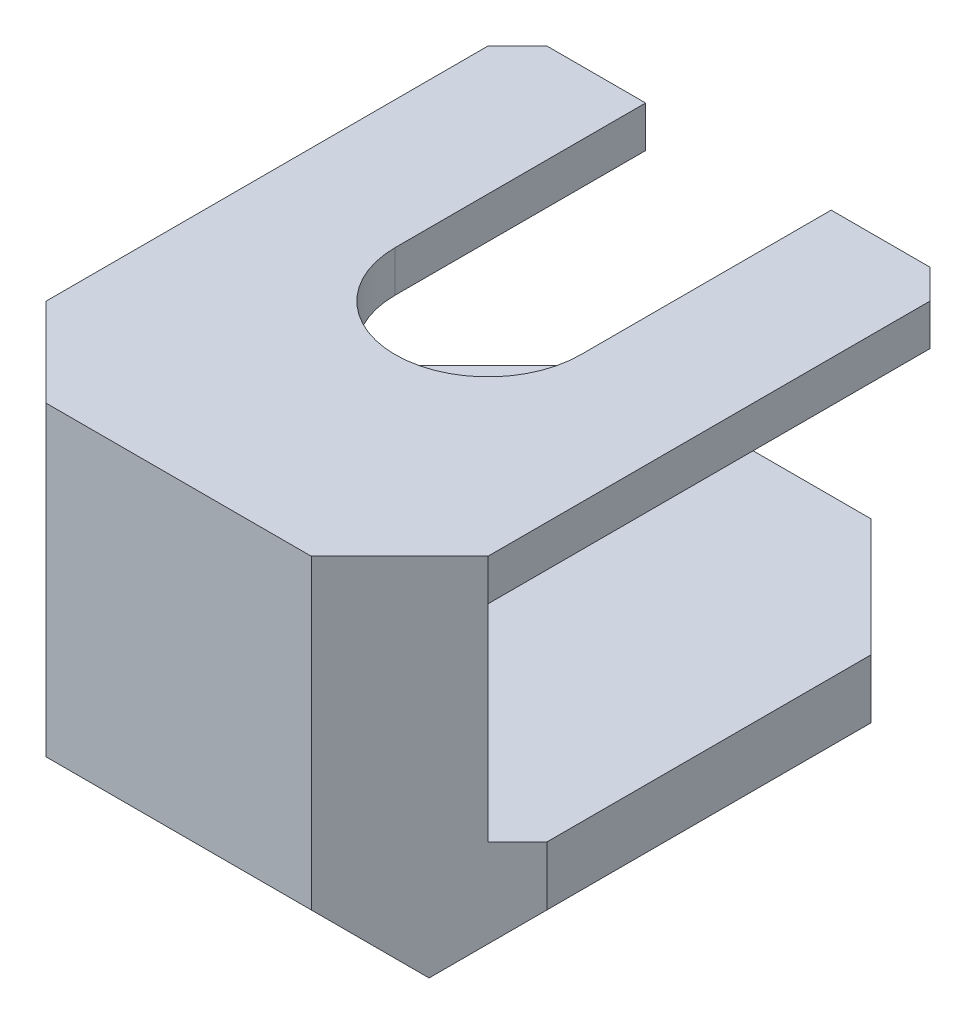
ISO-10303-21;
HEADER;
FILE_DESCRIPTION(('STEP AP214'),'2;1');
FILE_NAME('part.step','',(''),(''),'','','');
FILE_SCHEMA(('AUTOMOTIVE_DESIGN { 1 0 10303 214 1 1 1 1 }'));
ENDSEC;
DATA;
#1=APPLICATION_CONTEXT('core data for automotive mechanical design processes');
#2=APPLICATION_PROTOCOL_DEFINITION('international standard','automotive_design',2000,#1);
#3=PRODUCT_CONTEXT('',#1,'mechanical');
#4=PRODUCT('Part','Part','',(#3));
#5=PRODUCT_RELATED_PRODUCT_CATEGORY('part','',(#4));
#6=PRODUCT_DEFINITION_FORMATION('','',#4);
#7=PRODUCT_DEFINITION_CONTEXT('part definition',#1,'design');
#8=PRODUCT_DEFINITION('design','',#6,#7);
#9=PRODUCT_DEFINITION_SHAPE('','',#8);
#10=(LENGTH_UNIT() NAMED_UNIT(*) SI_UNIT(.MILLI.,.METRE.));
#11=(NAMED_UNIT(*) PLANE_ANGLE_UNIT() SI_UNIT($,.RADIAN.));
#12=(NAMED_UNIT(*) SI_UNIT($,.STERADIAN.) SOLID_ANGLE_UNIT());
#13=UNCERTAINTY_MEASURE_WITH_UNIT(LENGTH_MEASURE(1.E-05),#10,'distance_accuracy_value','');
#14=(GEOMETRIC_REPRESENTATION_CONTEXT(3) GLOBAL_UNCERTAINTY_ASSIGNED_CONTEXT((#13)) GLOBAL_UNIT_ASSIGNED_CONTEXT((#10,
#11,#12)) REPRESENTATION_CONTEXT('',''));
#15=CARTESIAN_POINT('',(0.,0.,0.));
#16=DIRECTION('',(0.,0.,1.));
#17=DIRECTION('',(1.,0.,0.));
#18=AXIS2_PLACEMENT_3D('',#15,#16,#17);
#19=CARTESIAN_POINT('',(-3.15,1.4,0.));
#20=DIRECTION('',(-1.,0.,0.));
#21=DIRECTION('',(0.,0.,1.));
#22=AXIS2_PLACEMENT_3D('',#19,#20,#21);
#23=PLANE('',#22);
#24=DIRECTION('',(0.,0.,-1.));
#25=VECTOR('',#24,1.);
#26=CARTESIAN_POINT('',(-3.15,0.,0.));
#27=LINE('',#26,#25);
#28=CARTESIAN_POINT('',(-3.15,0.,0.));
#29=VERTEX_POINT('',#28);
#30=CARTESIAN_POINT('',(-3.15,0.,-8.5));
#31=VERTEX_POINT('',#30);
#32=EDGE_CURVE('E285',#29,#31,#27,.T.);
#33=ORIENTED_EDGE('',*,*,#32,.T.);
#34=DIRECTION('',(0.,-1.,0.));
#35=VECTOR('',#34,1.);
#36=CARTESIAN_POINT('',(-3.15,1.4,-8.5));
#37=LINE('',#36,#35);
#38=CARTESIAN_POINT('',(-3.15,1.4,-8.5));
#39=VERTEX_POINT('',#38);
#40=EDGE_CURVE('E298',#39,#31,#37,.T.);
#41=ORIENTED_EDGE('',*,*,#40,.F.);
#42=DIRECTION('',(0.,0.,-1.));
#43=VECTOR('',#42,1.);
#44=CARTESIAN_POINT('',(-3.15,1.4,0.));
#45=LINE('',#44,#43);
#46=CARTESIAN_POINT('',(-3.15,1.4,0.));
#47=VERTEX_POINT('',#46);
#48=EDGE_CURVE('E272',#47,#39,#45,.T.);
#49=ORIENTED_EDGE('',*,*,#48,.F.);
#50=DIRECTION('',(0.,-1.,0.));
#51=VECTOR('',#50,1.);
#52=CARTESIAN_POINT('',(-3.15,1.4,0.));
#53=LINE('',#52,#51);
#54=EDGE_CURVE('E301',#47,#29,#53,.T.);
#55=ORIENTED_EDGE('',*,*,#54,.T.);
#56=EDGE_LOOP('',(#33,#41,#49,#55));
#57=FACE_BOUND('',#56,.T.);
#58=ADVANCED_FACE('F39',(#57),#23,.F.);
#59=CARTESIAN_POINT('',(0.,1.4,0.));
#60=DIRECTION('',(0.,-1.,0.));
#61=DIRECTION('',(0.,0.,-1.));
#62=AXIS2_PLACEMENT_3D('',#59,#60,#61);
#63=CYLINDRICAL_SURFACE('',#62,3.15);
#64=CARTESIAN_POINT('',(0.,0.,0.));
#65=DIRECTION('',(0.,-1.,0.));
#66=DIRECTION('',(0.,0.,1.));
#67=AXIS2_PLACEMENT_3D('',#64,#65,#66);
#68=CIRCLE('',#67,3.15);
#69=CARTESIAN_POINT('',(3.15,0.,0.));
#70=VERTEX_POINT('',#69);
#71=EDGE_CURVE('E267',#70,#29,#68,.T.);
#72=ORIENTED_EDGE('',*,*,#71,.T.);
#73=ORIENTED_EDGE('',*,*,#54,.F.);
#74=CARTESIAN_POINT('',(0.,1.4,0.));
#75=DIRECTION('',(0.,-1.,0.));
#76=DIRECTION('',(0.,0.,1.));
#77=AXIS2_PLACEMENT_3D('',#74,#75,#76);
#78=CIRCLE('',#77,3.15);
#79=CARTESIAN_POINT('',(3.15,1.4,0.));
#80=VERTEX_POINT('',#79);
#81=EDGE_CURVE('E269',#80,#47,#78,.T.);
#82=ORIENTED_EDGE('',*,*,#81,.F.);
#83=DIRECTION('',(0.,-1.,0.));
#84=VECTOR('',#83,1.);
#85=CARTESIAN_POINT('',(3.15,1.4,0.));
#86=LINE('',#85,#84);
#87=EDGE_CURVE('E282',#80,#70,#86,.T.);
#88=ORIENTED_EDGE('',*,*,#87,.T.);
#89=EDGE_LOOP('',(#72,#73,#82,#88));
#90=FACE_BOUND('',#89,.T.);
#91=ADVANCED_FACE('F376',(#90),#63,.F.);
#92=CARTESIAN_POINT('',(3.15,1.4,-8.5));
#93=DIRECTION('',(1.,0.,0.));
#94=DIRECTION('',(0.,0.,-1.));
#95=AXIS2_PLACEMENT_3D('',#92,#93,#94);
#96=PLANE('',#95);
#97=DIRECTION('',(0.,0.,1.));
#98=VECTOR('',#97,1.);
#99=CARTESIAN_POINT('',(3.15,0.,-8.5));
#100=LINE('',#99,#98);
#101=CARTESIAN_POINT('',(3.15,0.,-8.5));
#102=VERTEX_POINT('',#101);
#103=EDGE_CURVE('E273',#102,#70,#100,.T.);
#104=ORIENTED_EDGE('',*,*,#103,.T.);
#105=ORIENTED_EDGE('',*,*,#87,.F.);
#106=DIRECTION('',(0.,0.,1.));
#107=VECTOR('',#106,1.);
#108=CARTESIAN_POINT('',(3.15,1.4,-8.5));
#109=LINE('',#108,#107);
#110=CARTESIAN_POINT('',(3.15,1.4,-8.5));
#111=VERTEX_POINT('',#110);
#112=EDGE_CURVE('E280',#111,#80,#109,.T.);
#113=ORIENTED_EDGE('',*,*,#112,.F.);
#114=DIRECTION('',(0.,-1.,0.));
#115=VECTOR('',#114,1.);
#116=CARTESIAN_POINT('',(3.15,1.4,-8.5));
#117=LINE('',#116,#115);
#118=EDGE_CURVE('E295',#111,#102,#117,.T.);
#119=ORIENTED_EDGE('',*,*,#118,.T.);
#120=EDGE_LOOP('',(#104,#105,#113,#119));
#121=FACE_BOUND('',#120,.T.);
#122=ADVANCED_FACE('F380',(#121),#96,.F.);
#123=CARTESIAN_POINT('',(8.5,1.4,-8.5));
#124=DIRECTION('',(0.,0.,1.));
#125=DIRECTION('',(1.,0.,0.));
#126=AXIS2_PLACEMENT_3D('',#123,#124,#125);
#127=PLANE('',#126);
#128=DIRECTION('',(-1.,0.,0.));
#129=VECTOR('',#128,1.);
#130=CARTESIAN_POINT('',(8.5,1.4,-8.5));
#131=LINE('',#130,#129);
#132=CARTESIAN_POINT('',(6.49999999999998,1.4,-8.5));
#133=VERTEX_POINT('',#132);
#134=EDGE_CURVE('E278',#133,#111,#131,.T.);
#135=ORIENTED_EDGE('',*,*,#134,.F.);
#136=DIRECTION('',(0.,-1.,0.));
#137=VECTOR('',#136,1.);
#138=CARTESIAN_POINT('',(6.49999999999998,1.4,-8.5));
#139=LINE('',#138,#137);
#140=CARTESIAN_POINT('',(6.49999999999998,0.,-8.5));
#141=VERTEX_POINT('',#140);
#142=EDGE_CURVE('E44',#133,#141,#139,.T.);
#143=ORIENTED_EDGE('',*,*,#142,.T.);
#144=DIRECTION('',(-1.,0.,0.));
#145=VECTOR('',#144,1.);
#146=CARTESIAN_POINT('',(8.5,0.,-8.5));
#147=LINE('',#146,#145);
#148=EDGE_CURVE('E290',#141,#102,#147,.T.);
#149=ORIENTED_EDGE('',*,*,#148,.T.);
#150=ORIENTED_EDGE('',*,*,#118,.F.);
#151=EDGE_LOOP('',(#135,#143,#149,#150));
#152=FACE_BOUND('',#151,.T.);
#153=ADVANCED_FACE('F336',(#152),#127,.F.);
#154=CARTESIAN_POINT('',(-6.49999999999999,1.4,-8.5));
#155=DIRECTION('',(0.70710678118655,0.,0.707106781186545));
#156=DIRECTION('',(0.,1.,0.));
#157=AXIS2_PLACEMENT_3D('',#154,#155,#156);
#158=PLANE('',#157);
#159=DIRECTION('',(-0.707106781186545,0.,0.70710678118655));
#160=VECTOR('',#159,1.);
#161=CARTESIAN_POINT('',(-6.49999999999999,0.,-8.5));
#162=LINE('',#161,#160);
#163=CARTESIAN_POINT('',(-7.49999999999999,0.,-7.49999999999999));
#164=VERTEX_POINT('',#163);
#165=CARTESIAN_POINT('',(-6.49999999999999,0.,-8.5));
#166=VERTEX_POINT('',#165);
#167=EDGE_CURVE('E327',#164,#166,#162,.F.);
#168=ORIENTED_EDGE('',*,*,#167,.F.);
#169=DIRECTION('',(0.,-1.,0.));
#170=VECTOR('',#169,1.);
#171=CARTESIAN_POINT('',(-7.49999999999999,-21.001,-7.49999999999999));
#172=LINE('',#171,#170);
#173=CARTESIAN_POINT('',(-7.49999999999999,1.4,-7.49999999999999));
#174=VERTEX_POINT('',#173);
#175=EDGE_CURVE('E324',#174,#164,#172,.T.);
#176=ORIENTED_EDGE('',*,*,#175,.F.);
#177=DIRECTION('',(0.707106781186545,0.,-0.70710678118655));
#178=VECTOR('',#177,1.);
#179=CARTESIAN_POINT('',(-7.50000000000002,1.4,-7.49999999999996));
#180=LINE('',#179,#178);
#181=CARTESIAN_POINT('',(-6.49999999999999,1.4,-8.5));
#182=VERTEX_POINT('',#181);
#183=EDGE_CURVE('E322',#182,#174,#180,.F.);
#184=ORIENTED_EDGE('',*,*,#183,.F.);
#185=DIRECTION('',(0.,1.,0.));
#186=VECTOR('',#185,1.);
#187=CARTESIAN_POINT('',(-6.49999999999999,1.4,-8.5));
#188=LINE('',#187,#186);
#189=EDGE_CURVE('E317',#166,#182,#188,.T.);
#190=ORIENTED_EDGE('',*,*,#189,.F.);
#191=EDGE_LOOP('',(#168,#176,#184,#190));
#192=FACE_BOUND('',#191,.T.);
#193=ADVANCED_FACE('F366',(#192),#158,.F.);
#194=DIRECTION('',(-1.,0.,0.));
#195=VECTOR('',#194,1.);
#196=CARTESIAN_POINT('',(-3.15,0.,-8.5));
#197=LINE('',#196,#195);
#198=EDGE_CURVE('E287',#31,#166,#197,.T.);
#199=ORIENTED_EDGE('',*,*,#198,.T.);
#200=ORIENTED_EDGE('',*,*,#189,.T.);
#201=DIRECTION('',(-1.,0.,0.));
#202=VECTOR('',#201,1.);
#203=CARTESIAN_POINT('',(-3.15,1.4,-8.5));
#204=LINE('',#203,#202);
#205=EDGE_CURVE('E275',#39,#182,#204,.T.);
#206=ORIENTED_EDGE('',*,*,#205,.F.);
#207=ORIENTED_EDGE('',*,*,#40,.T.);
#208=EDGE_LOOP('',(#199,#200,#206,#207));
#209=FACE_BOUND('',#208,.T.);
#210=ADVANCED_FACE('F369',(#209),#127,.F.);
#211=CARTESIAN_POINT('',(7.49999999999999,-21.001,-7.5));
#212=DIRECTION('',(-0.707106781186545,0.,0.70710678118655));
#213=DIRECTION('',(0.,1.,0.));
#214=AXIS2_PLACEMENT_3D('',#211,#212,#213);
#215=PLANE('',#214);
#216=DIRECTION('',(-0.70710678118655,0.,-0.707106781186545));
#217=VECTOR('',#216,1.);
#218=CARTESIAN_POINT('',(7.49999999999999,0.,-7.5));
#219=LINE('',#218,#217);
#220=CARTESIAN_POINT('',(7.49999999999999,0.,-7.5));
#221=VERTEX_POINT('',#220);
#222=EDGE_CURVE('E62',#141,#221,#219,.F.);
#223=ORIENTED_EDGE('',*,*,#222,.F.);
#224=ORIENTED_EDGE('',*,*,#142,.F.);
#225=DIRECTION('',(0.70710678118655,0.,0.707106781186545));
#226=VECTOR('',#225,1.);
#227=CARTESIAN_POINT('',(7.49999999999997,1.4,-7.50000000000002));
#228=LINE('',#227,#226);
#229=CARTESIAN_POINT('',(7.49999999999999,1.4,-7.5));
#230=VERTEX_POINT('',#229);
#231=EDGE_CURVE('E320',#230,#133,#228,.F.);
#232=ORIENTED_EDGE('',*,*,#231,.F.);
#233=DIRECTION('',(0.,1.,0.));
#234=VECTOR('',#233,1.);
#235=CARTESIAN_POINT('',(7.49999999999999,-21.001,-7.5));
#236=LINE('',#235,#234);
#237=EDGE_CURVE('E328',#221,#230,#236,.T.);
#238=ORIENTED_EDGE('',*,*,#237,.F.);
#239=EDGE_LOOP('',(#223,#224,#232,#238));
#240=FACE_BOUND('',#239,.T.);
#241=ADVANCED_FACE('F42',(#240),#215,.F.);
#242=CARTESIAN_POINT('',(0.,0.,0.));
#243=DIRECTION('',(0.,1.,0.));
#244=DIRECTION('',(0.,0.,1.));
#245=AXIS2_PLACEMENT_3D('',#242,#243,#244);
#246=PLANE('',#245);
#247=DIRECTION('',(0.,0.,1.));
#248=VECTOR('',#247,1.);
#249=CARTESIAN_POINT('',(-7.49999999999999,0.,7.5));
#250=LINE('',#249,#248);
#251=CARTESIAN_POINT('',(-7.49999999999999,0.,7.5));
#252=VERTEX_POINT('',#251);
#253=EDGE_CURVE('E255',#164,#252,#250,.T.);
#254=ORIENTED_EDGE('',*,*,#253,.F.);
#255=ORIENTED_EDGE('',*,*,#167,.T.);
#256=ORIENTED_EDGE('',*,*,#198,.F.);
#257=ORIENTED_EDGE('',*,*,#32,.F.);
#258=ORIENTED_EDGE('',*,*,#71,.F.);
#259=ORIENTED_EDGE('',*,*,#103,.F.);
#260=ORIENTED_EDGE('',*,*,#148,.F.);
#261=ORIENTED_EDGE('',*,*,#222,.T.);
#262=DIRECTION('',(0.,0.,-1.));
#263=VECTOR('',#262,1.);
#264=CARTESIAN_POINT('',(7.49999999999999,0.,7.5));
#265=LINE('',#264,#263);
#266=CARTESIAN_POINT('',(7.49999999999999,0.,7.5));
#267=VERTEX_POINT('',#266);
#268=EDGE_CURVE('E249',#267,#221,#265,.T.);
#269=ORIENTED_EDGE('',*,*,#268,.F.);
#270=DIRECTION('',(-1.,0.,0.));
#271=VECTOR('',#270,1.);
#272=CARTESIAN_POINT('',(8.5,0.,7.5));
#273=LINE('',#272,#271);
#274=EDGE_CURVE('E265',#267,#252,#273,.T.);
#275=ORIENTED_EDGE('',*,*,#274,.T.);
#276=EDGE_LOOP('',(#254,#255,#256,#257,#258,#259,#260,#261,#269,#275));
#277=FACE_BOUND('',#276,.T.);
#278=ADVANCED_FACE('F341',(#277),#246,.F.);
#279=CARTESIAN_POINT('',(-7.49999999999999,-21.001,7.5));
#280=DIRECTION('',(1.,0.,0.));
#281=DIRECTION('',(0.,0.,-1.));
#282=AXIS2_PLACEMENT_3D('',#279,#280,#281);
#283=PLANE('',#282);
#284=DIRECTION('',(0.,0.,-1.));
#285=VECTOR('',#284,1.);
#286=CARTESIAN_POINT('',(-7.49999999999999,1.4,7.5));
#287=LINE('',#286,#285);
#288=CARTESIAN_POINT('',(-7.49999999999999,1.4,7.5));
#289=VERTEX_POINT('',#288);
#290=EDGE_CURVE('E257',#289,#174,#287,.T.);
#291=ORIENTED_EDGE('',*,*,#290,.T.);
#292=ORIENTED_EDGE('',*,*,#175,.T.);
#293=ORIENTED_EDGE('',*,*,#253,.T.);
#294=DIRECTION('',(0.,1.,0.));
#295=VECTOR('',#294,1.);
#296=CARTESIAN_POINT('',(-7.49999999999999,-21.001,7.5));
#297=LINE('',#296,#295);
#298=EDGE_CURVE('E260',#252,#289,#297,.T.);
#299=ORIENTED_EDGE('',*,*,#298,.T.);
#300=EDGE_LOOP('',(#291,#292,#293,#299));
#301=FACE_BOUND('',#300,.T.);
#302=ADVANCED_FACE('F464',(#301),#283,.F.);
#303=CARTESIAN_POINT('',(0.,0.,10.5));
#304=DIRECTION('',(0.,0.,1.));
#305=DIRECTION('',(1.,0.,0.));
#306=AXIS2_PLACEMENT_3D('',#303,#304,#305);
#307=PLANE('',#306);
#308=DIRECTION('',(0.,-1.,0.));
#309=VECTOR('',#308,1.);
#310=CARTESIAN_POINT('',(-4.5,-17.,10.5));
#311=LINE('',#310,#309);
#312=CARTESIAN_POINT('',(-4.5,1.4,10.5));
#313=VERTEX_POINT('',#312);
#314=CARTESIAN_POINT('',(-4.5,-8.99999999999998,10.5));
#315=VERTEX_POINT('',#314);
#316=EDGE_CURVE('E306',#313,#315,#311,.T.);
#317=ORIENTED_EDGE('',*,*,#316,.T.);
#318=DIRECTION('',(1.,0.,0.));
#319=VECTOR('',#318,1.);
#320=CARTESIAN_POINT('',(0.,-8.99999999999998,10.5));
#321=LINE('',#320,#319);
#322=CARTESIAN_POINT('',(4.5,-8.99999999999998,10.5));
#323=VERTEX_POINT('',#322);
#324=EDGE_CURVE('E739',#315,#323,#321,.T.);
#325=ORIENTED_EDGE('',*,*,#324,.T.);
#326=DIRECTION('',(0.,1.,0.));
#327=VECTOR('',#326,1.);
#328=CARTESIAN_POINT('',(4.5,1.4,10.5));
#329=LINE('',#328,#327);
#330=CARTESIAN_POINT('',(4.5,1.4,10.5));
#331=VERTEX_POINT('',#330);
#332=EDGE_CURVE('E304',#323,#331,#329,.T.);
#333=ORIENTED_EDGE('',*,*,#332,.T.);
#334=DIRECTION('',(-1.,0.,0.));
#335=VECTOR('',#334,1.);
#336=CARTESIAN_POINT('',(8.5,1.4,10.5));
#337=LINE('',#336,#335);
#338=EDGE_CURVE('E252',#331,#313,#337,.T.);
#339=ORIENTED_EDGE('',*,*,#338,.T.);
#340=EDGE_LOOP('',(#317,#325,#333,#339));
#341=FACE_BOUND('',#340,.T.);
#342=ADVANCED_FACE('F467',(#341),#307,.T.);
#343=CARTESIAN_POINT('',(0.,1.4,0.));
#344=DIRECTION('',(0.,1.,0.));
#345=DIRECTION('',(0.,0.,1.));
#346=AXIS2_PLACEMENT_3D('',#343,#344,#345);
#347=PLANE('',#346);
#348=ORIENTED_EDGE('',*,*,#205,.T.);
#349=ORIENTED_EDGE('',*,*,#183,.T.);
#350=ORIENTED_EDGE('',*,*,#290,.F.);
#351=DIRECTION('',(0.707106781186546,0.,0.707106781186549));
#352=VECTOR('',#351,1.);
#353=CARTESIAN_POINT('',(-7.50000000000001,1.4,7.49999999999998));
#354=LINE('',#353,#352);
#355=EDGE_CURVE('E315',#289,#313,#354,.T.);
#356=ORIENTED_EDGE('',*,*,#355,.T.);
#357=ORIENTED_EDGE('',*,*,#338,.F.);
#358=DIRECTION('',(0.707106781186546,0.,-0.707106781186549));
#359=VECTOR('',#358,1.);
#360=CARTESIAN_POINT('',(7.50000000000001,1.4,7.49999999999998));
#361=LINE('',#360,#359);
#362=CARTESIAN_POINT('',(7.49999999999999,1.4,7.5));
#363=VERTEX_POINT('',#362);
#364=EDGE_CURVE('E312',#331,#363,#361,.T.);
#365=ORIENTED_EDGE('',*,*,#364,.T.);
#366=DIRECTION('',(0.,0.,1.));
#367=VECTOR('',#366,1.);
#368=CARTESIAN_POINT('',(7.49999999999999,1.4,7.5));
#369=LINE('',#368,#367);
#370=EDGE_CURVE('E247',#230,#363,#369,.T.);
#371=ORIENTED_EDGE('',*,*,#370,.F.);
#372=ORIENTED_EDGE('',*,*,#231,.T.);
#373=ORIENTED_EDGE('',*,*,#134,.T.);
#374=ORIENTED_EDGE('',*,*,#112,.T.);
#375=ORIENTED_EDGE('',*,*,#81,.T.);
#376=ORIENTED_EDGE('',*,*,#48,.T.);
#377=EDGE_LOOP('',(#348,#349,#350,#356,#357,#365,#371,#372,#373,#374,#375,#376));
#378=FACE_BOUND('',#377,.T.);
#379=ADVANCED_FACE('F344',(#378),#347,.T.);
#380=CARTESIAN_POINT('',(7.49999999999999,-21.001,7.5));
#381=DIRECTION('',(-1.,0.,0.));
#382=DIRECTION('',(0.,0.,1.));
#383=AXIS2_PLACEMENT_3D('',#380,#381,#382);
#384=PLANE('',#383);
#385=ORIENTED_EDGE('',*,*,#268,.T.);
#386=ORIENTED_EDGE('',*,*,#237,.T.);
#387=ORIENTED_EDGE('',*,*,#370,.T.);
#388=DIRECTION('',(0.,1.,0.));
#389=VECTOR('',#388,1.);
#390=CARTESIAN_POINT('',(7.49999999999999,-21.001,7.5));
#391=LINE('',#390,#389);
#392=EDGE_CURVE('E250',#267,#363,#391,.T.);
#393=ORIENTED_EDGE('',*,*,#392,.F.);
#394=EDGE_LOOP('',(#385,#386,#387,#393));
#395=FACE_BOUND('',#394,.T.);
#396=ADVANCED_FACE('F347',(#395),#384,.F.);
#397=CARTESIAN_POINT('',(0.,0.,7.5));
#398=DIRECTION('',(0.,0.,-1.));
#399=DIRECTION('',(-1.,0.,0.));
#400=AXIS2_PLACEMENT_3D('',#397,#398,#399);
#401=PLANE('',#400);
#402=DIRECTION('',(1.,0.,0.));
#403=VECTOR('',#402,1.);
#404=CARTESIAN_POINT('',(8.5,-7.,7.5));
#405=LINE('',#404,#403);
#406=CARTESIAN_POINT('',(-7.49999999999999,-7.,7.5));
#407=VERTEX_POINT('',#406);
#408=CARTESIAN_POINT('',(7.49999999999999,-7.,7.5));
#409=VERTEX_POINT('',#408);
#410=EDGE_CURVE('E12',#407,#409,#405,.T.);
#411=ORIENTED_EDGE('',*,*,#410,.F.);
#412=DIRECTION('',(0.,1.,0.));
#413=VECTOR('',#412,1.);
#414=CARTESIAN_POINT('',(-7.49999999999999,0.,7.5));
#415=LINE('',#414,#413);
#416=EDGE_CURVE('E310',#407,#252,#415,.T.);
#417=ORIENTED_EDGE('',*,*,#416,.T.);
#418=ORIENTED_EDGE('',*,*,#274,.F.);
#419=DIRECTION('',(0.,-1.,0.));
#420=VECTOR('',#419,1.);
#421=CARTESIAN_POINT('',(7.49999999999999,0.,7.5));
#422=LINE('',#421,#420);
#423=EDGE_CURVE('E308',#267,#409,#422,.T.);
#424=ORIENTED_EDGE('',*,*,#423,.T.);
#425=EDGE_LOOP('',(#411,#417,#418,#424));
#426=FACE_BOUND('',#425,.T.);
#427=ADVANCED_FACE('F353',(#426),#401,.T.);
#428=CARTESIAN_POINT('',(4.5,0.,10.5));
#429=DIRECTION('',(0.707106781186549,0.,0.707106781186546));
#430=DIRECTION('',(0.,-1.,0.));
#431=AXIS2_PLACEMENT_3D('',#428,#429,#430);
#432=PLANE('',#431);
#433=ORIENTED_EDGE('',*,*,#332,.F.);
#434=DIRECTION('',(0.577350269189624,-0.577350269189628,-0.577350269189626));
#435=VECTOR('',#434,1.);
#436=CARTESIAN_POINT('',(3.00000000000001,-7.49999999999998,12.));
#437=LINE('',#436,#435);
#438=CARTESIAN_POINT('',(6.5,-11.,8.5));
#439=VERTEX_POINT('',#438);
#440=EDGE_CURVE('E239',#439,#323,#437,.F.);
#441=ORIENTED_EDGE('',*,*,#440,.F.);
#442=DIRECTION('',(-0.577350269189624,-0.577350269189626,0.577350269189626));
#443=VECTOR('',#442,1.);
#444=CARTESIAN_POINT('',(7.99999999999999,-9.49999999999999,6.99999999999999));
#445=LINE('',#444,#443);
#446=CARTESIAN_POINT('',(8.5,-8.99999999999998,6.49999999999998));
#447=VERTEX_POINT('',#446);
#448=EDGE_CURVE('E210',#447,#439,#445,.T.);
#449=ORIENTED_EDGE('',*,*,#448,.F.);
#450=DIRECTION('',(0.,-1.,0.));
#451=VECTOR('',#450,1.);
#452=CARTESIAN_POINT('',(8.5,-8.99999999999998,6.49999999999998));
#453=LINE('',#452,#451);
#454=CARTESIAN_POINT('',(8.5,-7.,6.49999999999998));
#455=VERTEX_POINT('',#454);
#456=EDGE_CURVE('E233',#455,#447,#453,.T.);
#457=ORIENTED_EDGE('',*,*,#456,.F.);
#458=DIRECTION('',(-0.707106781186546,0.,0.707106781186549));
#459=VECTOR('',#458,1.);
#460=CARTESIAN_POINT('',(4.5,-7.,10.5));
#461=LINE('',#460,#459);
#462=EDGE_CURVE('E243',#455,#409,#461,.T.);
#463=ORIENTED_EDGE('',*,*,#462,.T.);
#464=ORIENTED_EDGE('',*,*,#423,.F.);
#465=ORIENTED_EDGE('',*,*,#392,.T.);
#466=ORIENTED_EDGE('',*,*,#364,.F.);
#467=EDGE_LOOP('',(#433,#441,#449,#457,#463,#464,#465,#466));
#468=FACE_BOUND('',#467,.T.);
#469=ADVANCED_FACE('F350',(#468),#432,.T.);
#470=CARTESIAN_POINT('',(-4.5,0.,10.5));
#471=DIRECTION('',(-0.707106781186549,0.,0.707106781186546));
#472=DIRECTION('',(0.,1.,0.));
#473=AXIS2_PLACEMENT_3D('',#470,#471,#472);
#474=PLANE('',#473);
#475=ORIENTED_EDGE('',*,*,#416,.F.);
#476=DIRECTION('',(-0.707106781186546,0.,-0.707106781186549));
#477=VECTOR('',#476,1.);
#478=CARTESIAN_POINT('',(-4.5,-7.,10.5));
#479=LINE('',#478,#477);
#480=CARTESIAN_POINT('',(-8.5,-7.,6.49999999999999));
#481=VERTEX_POINT('',#480);
#482=EDGE_CURVE('E219',#407,#481,#479,.T.);
#483=ORIENTED_EDGE('',*,*,#482,.T.);
#484=DIRECTION('',(0.,1.,0.));
#485=VECTOR('',#484,1.);
#486=CARTESIAN_POINT('',(-8.5,9.4,6.49999999999999));
#487=LINE('',#486,#485);
#488=CARTESIAN_POINT('',(-8.5,-8.99999999999998,6.49999999999999));
#489=VERTEX_POINT('',#488);
#490=EDGE_CURVE('E218',#489,#481,#487,.T.);
#491=ORIENTED_EDGE('',*,*,#490,.F.);
#492=DIRECTION('',(-0.577350269189625,0.577350269189626,-0.577350269189627));
#493=VECTOR('',#492,1.);
#494=CARTESIAN_POINT('',(-7.99999999999999,-9.49999999999999,6.99999999999999));
#495=LINE('',#494,#493);
#496=CARTESIAN_POINT('',(-6.5,-11.,8.5));
#497=VERTEX_POINT('',#496);
#498=EDGE_CURVE('E226',#497,#489,#495,.T.);
#499=ORIENTED_EDGE('',*,*,#498,.F.);
#500=DIRECTION('',(0.577350269189624,0.577350269189628,0.577350269189626));
#501=VECTOR('',#500,1.);
#502=CARTESIAN_POINT('',(-3.00000000000001,-7.49999999999998,12.));
#503=LINE('',#502,#501);
#504=EDGE_CURVE('E246',#315,#497,#503,.F.);
#505=ORIENTED_EDGE('',*,*,#504,.F.);
#506=ORIENTED_EDGE('',*,*,#316,.F.);
#507=ORIENTED_EDGE('',*,*,#355,.F.);
#508=ORIENTED_EDGE('',*,*,#298,.F.);
#509=EDGE_LOOP('',(#475,#483,#491,#499,#505,#506,#507,#508));
#510=FACE_BOUND('',#509,.T.);
#511=ADVANCED_FACE('F356',(#510),#474,.T.);
#512=CARTESIAN_POINT('',(-4.49999999999998,-7.,-8.5));
#513=DIRECTION('',(0.,1.,0.));
#514=DIRECTION('',(0.,0.,1.));
#515=AXIS2_PLACEMENT_3D('',#512,#513,#514);
#516=PLANE('',#515);
#517=ORIENTED_EDGE('',*,*,#482,.F.);
#518=ORIENTED_EDGE('',*,*,#410,.T.);
#519=ORIENTED_EDGE('',*,*,#462,.F.);
#520=DIRECTION('',(0.,0.,-1.));
#521=VECTOR('',#520,1.);
#522=CARTESIAN_POINT('',(8.5,-7.,8.5));
#523=LINE('',#522,#521);
#524=CARTESIAN_POINT('',(8.5,-7.,-4.49999999999997));
#525=VERTEX_POINT('',#524);
#526=EDGE_CURVE('E220',#455,#525,#523,.T.);
#527=ORIENTED_EDGE('',*,*,#526,.T.);
#528=DIRECTION('',(0.707106781186551,0.,0.707106781186544));
#529=VECTOR('',#528,1.);
#530=CARTESIAN_POINT('',(4.49999999999993,-7.,-8.5));
#531=LINE('',#530,#529);
#532=CARTESIAN_POINT('',(4.49999999999993,-7.,-8.5));
#533=VERTEX_POINT('',#532);
#534=EDGE_CURVE('E209',#525,#533,#531,.F.);
#535=ORIENTED_EDGE('',*,*,#534,.T.);
#536=DIRECTION('',(1.,0.,0.));
#537=VECTOR('',#536,1.);
#538=CARTESIAN_POINT('',(-8.5,-7.,-8.5));
#539=LINE('',#538,#537);
#540=CARTESIAN_POINT('',(-4.49999999999998,-7.,-8.5));
#541=VERTEX_POINT('',#540);
#542=EDGE_CURVE('E205',#541,#533,#539,.T.);
#543=ORIENTED_EDGE('',*,*,#542,.F.);
#544=DIRECTION('',(0.707106781186544,0.,-0.707106781186551));
#545=VECTOR('',#544,1.);
#546=CARTESIAN_POINT('',(-8.5,-7.,-4.49999999999993));
#547=LINE('',#546,#545);
#548=CARTESIAN_POINT('',(-8.5,-7.,-4.49999999999993));
#549=VERTEX_POINT('',#548);
#550=EDGE_CURVE('E198',#541,#549,#547,.F.);
#551=ORIENTED_EDGE('',*,*,#550,.T.);
#552=DIRECTION('',(0.,0.,1.));
#553=VECTOR('',#552,1.);
#554=CARTESIAN_POINT('',(-8.5,-7.,-8.5));
#555=LINE('',#554,#553);
#556=EDGE_CURVE('E202',#549,#481,#555,.T.);
#557=ORIENTED_EDGE('',*,*,#556,.T.);
#558=EDGE_LOOP('',(#517,#518,#519,#527,#535,#543,#551,#557));
#559=FACE_BOUND('',#558,.T.);
#560=ADVANCED_FACE('F201',(#559),#516,.T.);
#561=CARTESIAN_POINT('',(0.,-8.5,0.));
#562=DIRECTION('',(0.,-1.,0.));
#563=DIRECTION('',(0.,0.,-1.));
#564=AXIS2_PLACEMENT_3D('',#561,#562,#563);
#565=PLANE('',#564);
#566=CARTESIAN_POINT('',(0.,-8.5,0.));
#567=DIRECTION('',(0.,-1.,0.));
#568=DIRECTION('',(0.,0.,-1.));
#569=AXIS2_PLACEMENT_3D('',#566,#567,#568);
#570=CIRCLE('',#569,2.45);
#571=CARTESIAN_POINT('',(0.,-8.5,-2.45));
#572=VERTEX_POINT('',#571);
#573=EDGE_CURVE('E746',#572,#572,#570,.T.);
#574=ORIENTED_EDGE('',*,*,#573,.T.);
#575=EDGE_LOOP('',(#574));
#576=FACE_BOUND('',#575,.T.);
#577=ADVANCED_FACE('F397',(#576),#565,.T.);
#578=CARTESIAN_POINT('',(0.,-8.5,0.));
#579=DIRECTION('',(0.,-1.,0.));
#580=DIRECTION('',(0.,0.,-1.));
#581=AXIS2_PLACEMENT_3D('',#578,#579,#580);
#582=CYLINDRICAL_SURFACE('',#581,2.45);
#583=ORIENTED_EDGE('',*,*,#573,.F.);
#584=EDGE_LOOP('',(#583));
#585=FACE_BOUND('',#584,.T.);
#586=CARTESIAN_POINT('',(0.,-13.,0.));
#587=DIRECTION('',(0.,-1.,0.));
#588=DIRECTION('',(0.,0.,-1.));
#589=AXIS2_PLACEMENT_3D('',#586,#587,#588);
#590=CIRCLE('',#589,2.45);
#591=CARTESIAN_POINT('',(0.,-13.,-2.45));
#592=VERTEX_POINT('',#591);
#593=EDGE_CURVE('E752',#592,#592,#590,.T.);
#594=ORIENTED_EDGE('',*,*,#593,.T.);
#595=EDGE_LOOP('',(#594));
#596=FACE_BOUND('',#595,.T.);
#597=ADVANCED_FACE('F423',(#585,#596),#582,.F.);
#598=CARTESIAN_POINT('',(0.,-13.,0.));
#599=DIRECTION('',(0.,-1.,0.));
#600=DIRECTION('',(0.,0.,-1.));
#601=AXIS2_PLACEMENT_3D('',#598,#599,#600);
#602=PLANE('',#601);
#603=DIRECTION('',(0.,0.,1.));
#604=VECTOR('',#603,1.);
#605=CARTESIAN_POINT('',(4.5,-13.,10.5));
#606=LINE('',#605,#604);
#607=CARTESIAN_POINT('',(4.5,-13.,-4.5));
#608=VERTEX_POINT('',#607);
#609=CARTESIAN_POINT('',(4.5,-13.,6.5));
#610=VERTEX_POINT('',#609);
#611=EDGE_CURVE('E748',#608,#610,#606,.T.);
#612=ORIENTED_EDGE('',*,*,#611,.T.);
#613=DIRECTION('',(-1.,0.,0.));
#614=VECTOR('',#613,1.);
#615=CARTESIAN_POINT('',(0.,-13.,6.5));
#616=LINE('',#615,#614);
#617=CARTESIAN_POINT('',(-4.5,-13.,6.5));
#618=VERTEX_POINT('',#617);
#619=EDGE_CURVE('E778',#610,#618,#616,.T.);
#620=ORIENTED_EDGE('',*,*,#619,.T.);
#621=DIRECTION('',(0.,0.,-1.));
#622=VECTOR('',#621,1.);
#623=CARTESIAN_POINT('',(-4.5,-13.,-8.5));
#624=LINE('',#623,#622);
#625=CARTESIAN_POINT('',(-4.5,-13.,-4.5));
#626=VERTEX_POINT('',#625);
#627=EDGE_CURVE('E781',#618,#626,#624,.T.);
#628=ORIENTED_EDGE('',*,*,#627,.T.);
#629=DIRECTION('',(1.,0.,0.));
#630=VECTOR('',#629,1.);
#631=CARTESIAN_POINT('',(8.5,-13.,-4.5));
#632=LINE('',#631,#630);
#633=EDGE_CURVE('E744',#626,#608,#632,.T.);
#634=ORIENTED_EDGE('',*,*,#633,.T.);
#635=EDGE_LOOP('',(#612,#620,#628,#634));
#636=FACE_BOUND('',#635,.T.);
#637=ORIENTED_EDGE('',*,*,#593,.F.);
#638=EDGE_LOOP('',(#637));
#639=FACE_BOUND('',#638,.T.);
#640=ADVANCED_FACE('F429',(#636,#639),#602,.T.);
#641=CARTESIAN_POINT('',(8.5,9.4,-8.5));
#642=DIRECTION('',(0.,0.,1.));
#643=DIRECTION('',(1.,0.,0.));
#644=AXIS2_PLACEMENT_3D('',#641,#642,#643);
#645=PLANE('',#644);
#646=DIRECTION('',(-1.,0.,0.));
#647=VECTOR('',#646,1.);
#648=CARTESIAN_POINT('',(-8.5,-8.99999999999998,-8.5));
#649=LINE('',#648,#647);
#650=CARTESIAN_POINT('',(4.49999999999993,-8.99999999999998,-8.5));
#651=VERTEX_POINT('',#650);
#652=CARTESIAN_POINT('',(-4.49999999999998,-8.99999999999998,-8.5));
#653=VERTEX_POINT('',#652);
#654=EDGE_CURVE('E228',#651,#653,#649,.T.);
#655=ORIENTED_EDGE('',*,*,#654,.T.);
#656=DIRECTION('',(0.,1.,0.));
#657=VECTOR('',#656,1.);
#658=CARTESIAN_POINT('',(-4.49999999999997,9.4,-8.5));
#659=LINE('',#658,#657);
#660=EDGE_CURVE('E794',#653,#541,#659,.T.);
#661=ORIENTED_EDGE('',*,*,#660,.T.);
#662=ORIENTED_EDGE('',*,*,#542,.T.);
#663=DIRECTION('',(0.,-1.,0.));
#664=VECTOR('',#663,1.);
#665=CARTESIAN_POINT('',(4.49999999999993,9.4,-8.5));
#666=LINE('',#665,#664);
#667=EDGE_CURVE('E796',#533,#651,#666,.T.);
#668=ORIENTED_EDGE('',*,*,#667,.T.);
#669=EDGE_LOOP('',(#655,#661,#662,#668));
#670=FACE_BOUND('',#669,.T.);
#671=ADVANCED_FACE('F435',(#670),#645,.F.);
#672=CARTESIAN_POINT('',(0.,-13.,-4.5));
#673=DIRECTION('',(0.,-0.707106781186546,-0.707106781186549));
#674=DIRECTION('',(-1.,0.,0.));
#675=AXIS2_PLACEMENT_3D('',#672,#673,#674);
#676=PLANE('',#675);
#677=DIRECTION('',(-0.577350269189625,0.577350269189627,-0.577350269189625));
#678=VECTOR('',#677,1.);
#679=CARTESIAN_POINT('',(-3.,-14.5,-3.));
#680=LINE('',#679,#678);
#681=CARTESIAN_POINT('',(-6.49999999999998,-11.,-6.49999999999997));
#682=VERTEX_POINT('',#681);
#683=EDGE_CURVE('E754',#682,#626,#680,.F.);
#684=ORIENTED_EDGE('',*,*,#683,.F.);
#685=DIRECTION('',(-0.577350269189621,-0.577350269189629,0.577350269189627));
#686=VECTOR('',#685,1.);
#687=CARTESIAN_POINT('',(-5.66666666666667,-10.1666666666667,-7.33333333333329));
#688=LINE('',#687,#686);
#689=EDGE_CURVE('E799',#682,#653,#688,.F.);
#690=ORIENTED_EDGE('',*,*,#689,.T.);
#691=ORIENTED_EDGE('',*,*,#654,.F.);
#692=DIRECTION('',(-0.577350269189629,0.577350269189625,-0.577350269189623));
#693=VECTOR('',#692,1.);
#694=CARTESIAN_POINT('',(5.66666666666662,-10.1666666666667,-7.33333333333333));
#695=LINE('',#694,#693);
#696=CARTESIAN_POINT('',(6.49999999999998,-11.,-6.49999999999998));
#697=VERTEX_POINT('',#696);
#698=EDGE_CURVE('E801',#651,#697,#695,.F.);
#699=ORIENTED_EDGE('',*,*,#698,.T.);
#700=DIRECTION('',(-0.577350269189625,-0.577350269189627,0.577350269189625));
#701=VECTOR('',#700,1.);
#702=CARTESIAN_POINT('',(3.,-14.5,-3.));
#703=LINE('',#702,#701);
#704=EDGE_CURVE('E759',#608,#697,#703,.F.);
#705=ORIENTED_EDGE('',*,*,#704,.F.);
#706=ORIENTED_EDGE('',*,*,#633,.F.);
#707=EDGE_LOOP('',(#684,#690,#691,#699,#705,#706));
#708=FACE_BOUND('',#707,.T.);
#709=ADVANCED_FACE('F437',(#708),#676,.T.);
#710=CARTESIAN_POINT('',(-4.5,-13.,0.));
#711=DIRECTION('',(-0.707106781186549,-0.707106781186546,0.));
#712=DIRECTION('',(0.,0.,1.));
#713=AXIS2_PLACEMENT_3D('',#710,#711,#712);
#714=PLANE('',#713);
#715=DIRECTION('',(0.,0.,1.));
#716=VECTOR('',#715,1.);
#717=CARTESIAN_POINT('',(-8.5,-8.99999999999998,10.5));
#718=LINE('',#717,#716);
#719=CARTESIAN_POINT('',(-8.5,-8.99999999999998,-4.49999999999993));
#720=VERTEX_POINT('',#719);
#721=EDGE_CURVE('E776',#720,#489,#718,.T.);
#722=ORIENTED_EDGE('',*,*,#721,.F.);
#723=DIRECTION('',(-0.577350269189623,0.577350269189625,0.577350269189629));
#724=VECTOR('',#723,1.);
#725=CARTESIAN_POINT('',(-7.33333333333333,-10.1666666666667,-5.66666666666662));
#726=LINE('',#725,#724);
#727=EDGE_CURVE('E224',#720,#682,#726,.F.);
#728=ORIENTED_EDGE('',*,*,#727,.T.);
#729=ORIENTED_EDGE('',*,*,#683,.T.);
#730=ORIENTED_EDGE('',*,*,#627,.F.);
#731=DIRECTION('',(0.577350269189625,-0.577350269189627,-0.577350269189625));
#732=VECTOR('',#731,1.);
#733=CARTESIAN_POINT('',(-2.33333333333334,-15.1666666666667,4.33333333333334));
#734=LINE('',#733,#732);
#735=EDGE_CURVE('E765',#497,#618,#734,.T.);
#736=ORIENTED_EDGE('',*,*,#735,.F.);
#737=ORIENTED_EDGE('',*,*,#498,.T.);
#738=EDGE_LOOP('',(#722,#728,#729,#730,#736,#737));
#739=FACE_BOUND('',#738,.T.);
#740=ADVANCED_FACE('F443',(#739),#714,.T.);
#741=CARTESIAN_POINT('',(-8.5,9.4,-8.5));
#742=DIRECTION('',(1.,0.,0.));
#743=DIRECTION('',(0.,0.,-1.));
#744=AXIS2_PLACEMENT_3D('',#741,#742,#743);
#745=PLANE('',#744);
#746=ORIENTED_EDGE('',*,*,#556,.F.);
#747=DIRECTION('',(0.,-1.,0.));
#748=VECTOR('',#747,1.);
#749=CARTESIAN_POINT('',(-8.5,9.4,-4.49999999999993));
#750=LINE('',#749,#748);
#751=EDGE_CURVE('E215',#549,#720,#750,.T.);
#752=ORIENTED_EDGE('',*,*,#751,.T.);
#753=ORIENTED_EDGE('',*,*,#721,.T.);
#754=ORIENTED_EDGE('',*,*,#490,.T.);
#755=EDGE_LOOP('',(#746,#752,#753,#754));
#756=FACE_BOUND('',#755,.T.);
#757=ADVANCED_FACE('F213',(#756),#745,.F.);
#758=CARTESIAN_POINT('',(4.5,-13.,0.));
#759=DIRECTION('',(0.707106781186549,-0.707106781186546,0.));
#760=DIRECTION('',(0.,0.,-1.));
#761=AXIS2_PLACEMENT_3D('',#758,#759,#760);
#762=PLANE('',#761);
#763=ORIENTED_EDGE('',*,*,#704,.T.);
#764=DIRECTION('',(-0.577350269189627,-0.577350269189629,-0.577350269189621));
#765=VECTOR('',#764,1.);
#766=CARTESIAN_POINT('',(7.33333333333329,-10.1666666666667,-5.66666666666667));
#767=LINE('',#766,#765);
#768=CARTESIAN_POINT('',(8.5,-8.99999999999998,-4.49999999999997));
#769=VERTEX_POINT('',#768);
#770=EDGE_CURVE('E235',#697,#769,#767,.F.);
#771=ORIENTED_EDGE('',*,*,#770,.T.);
#772=DIRECTION('',(0.,0.,-1.));
#773=VECTOR('',#772,1.);
#774=CARTESIAN_POINT('',(8.5,-8.99999999999998,-8.5));
#775=LINE('',#774,#773);
#776=EDGE_CURVE('E773',#447,#769,#775,.T.);
#777=ORIENTED_EDGE('',*,*,#776,.F.);
#778=ORIENTED_EDGE('',*,*,#448,.T.);
#779=DIRECTION('',(0.577350269189625,0.577350269189627,0.577350269189625));
#780=VECTOR('',#779,1.);
#781=CARTESIAN_POINT('',(2.33333333333334,-15.1666666666667,4.33333333333334));
#782=LINE('',#781,#780);
#783=EDGE_CURVE('E262',#610,#439,#782,.T.);
#784=ORIENTED_EDGE('',*,*,#783,.F.);
#785=ORIENTED_EDGE('',*,*,#611,.F.);
#786=EDGE_LOOP('',(#763,#771,#777,#778,#784,#785));
#787=FACE_BOUND('',#786,.T.);
#788=ADVANCED_FACE('F442',(#787),#762,.T.);
#789=CARTESIAN_POINT('',(0.,-8.99999999999998,10.5));
#790=DIRECTION('',(0.,0.707106781186546,-0.707106781186549));
#791=DIRECTION('',(1.,0.,0.));
#792=AXIS2_PLACEMENT_3D('',#789,#790,#791);
#793=PLANE('',#792);
#794=ORIENTED_EDGE('',*,*,#324,.F.);
#795=ORIENTED_EDGE('',*,*,#504,.T.);
#796=ORIENTED_EDGE('',*,*,#735,.T.);
#797=ORIENTED_EDGE('',*,*,#619,.F.);
#798=ORIENTED_EDGE('',*,*,#783,.T.);
#799=ORIENTED_EDGE('',*,*,#440,.T.);
#800=EDGE_LOOP('',(#794,#795,#796,#797,#798,#799));
#801=FACE_BOUND('',#800,.T.);
#802=ADVANCED_FACE('F448',(#801),#793,.F.);
#803=CARTESIAN_POINT('',(8.5,9.4,8.5));
#804=DIRECTION('',(-1.,0.,0.));
#805=DIRECTION('',(0.,0.,1.));
#806=AXIS2_PLACEMENT_3D('',#803,#804,#805);
#807=PLANE('',#806);
#808=ORIENTED_EDGE('',*,*,#526,.F.);
#809=ORIENTED_EDGE('',*,*,#456,.T.);
#810=ORIENTED_EDGE('',*,*,#776,.T.);
#811=DIRECTION('',(0.,1.,0.));
#812=VECTOR('',#811,1.);
#813=CARTESIAN_POINT('',(8.5,9.4,-4.49999999999997));
#814=LINE('',#813,#812);
#815=EDGE_CURVE('E236',#769,#525,#814,.T.);
#816=ORIENTED_EDGE('',*,*,#815,.T.);
#817=EDGE_LOOP('',(#808,#809,#810,#816));
#818=FACE_BOUND('',#817,.T.);
#819=ADVANCED_FACE('F444',(#818),#807,.F.);
#820=CARTESIAN_POINT('',(4.49999999999993,9.4,-8.5));
#821=DIRECTION('',(-0.707106781186544,0.,0.707106781186551));
#822=DIRECTION('',(0.,-1.,0.));
#823=AXIS2_PLACEMENT_3D('',#820,#821,#822);
#824=PLANE('',#823);
#825=ORIENTED_EDGE('',*,*,#534,.F.);
#826=ORIENTED_EDGE('',*,*,#815,.F.);
#827=ORIENTED_EDGE('',*,*,#770,.F.);
#828=ORIENTED_EDGE('',*,*,#698,.F.);
#829=ORIENTED_EDGE('',*,*,#667,.F.);
#830=EDGE_LOOP('',(#825,#826,#827,#828,#829));
#831=FACE_BOUND('',#830,.T.);
#832=ADVANCED_FACE('F447',(#831),#824,.F.);
#833=CARTESIAN_POINT('',(-8.5,9.4,-4.49999999999993));
#834=DIRECTION('',(0.707106781186551,0.,0.707106781186544));
#835=DIRECTION('',(0.,-1.,0.));
#836=AXIS2_PLACEMENT_3D('',#833,#834,#835);
#837=PLANE('',#836);
#838=ORIENTED_EDGE('',*,*,#751,.F.);
#839=ORIENTED_EDGE('',*,*,#550,.F.);
#840=ORIENTED_EDGE('',*,*,#660,.F.);
#841=ORIENTED_EDGE('',*,*,#689,.F.);
#842=ORIENTED_EDGE('',*,*,#727,.F.);
#843=EDGE_LOOP('',(#838,#839,#840,#841,#842));
#844=FACE_BOUND('',#843,.T.);
#845=ADVANCED_FACE('F222',(#844),#837,.F.);
#846=CLOSED_SHELL('',(#58,#91,#122,#153,#193,#210,#241,#278,#302,#342,#379,#396,#427,#469,#511,
#560,#577,#597,#640,#671,#709,#740,#757,#788,#802,#819,#832,#845));
#847=MANIFOLD_SOLID_BREP('B2',#846);
#848=ADVANCED_BREP_SHAPE_REPRESENTATION('',(#18,#847),#14);
#849=SHAPE_DEFINITION_REPRESENTATION(#9,#848);
ENDSEC;
END-ISO-10303-21;
